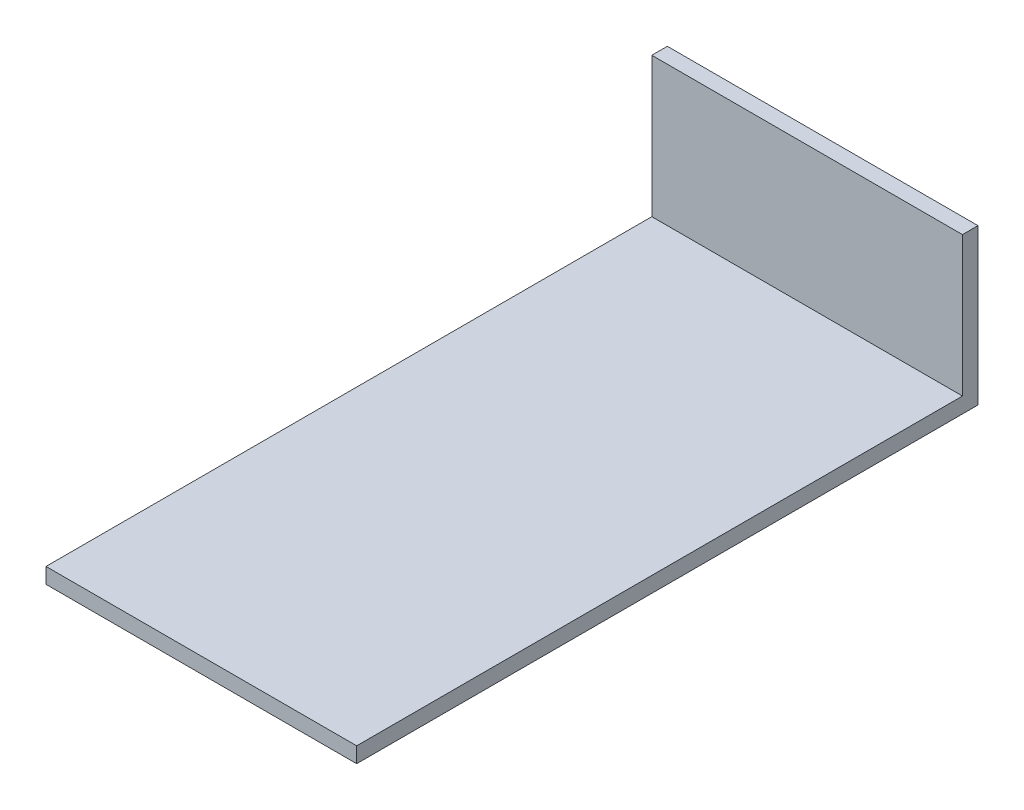
ISO-10303-21;
HEADER;
FILE_DESCRIPTION(('STEP AP214'),'2;1');
FILE_NAME('part.step','',(''),(''),'','','');
FILE_SCHEMA(('AUTOMOTIVE_DESIGN { 1 0 10303 214 1 1 1 1 }'));
ENDSEC;
DATA;
#1=APPLICATION_CONTEXT('core data for automotive mechanical design processes');
#2=APPLICATION_PROTOCOL_DEFINITION('international standard','automotive_design',2000,#1);
#3=PRODUCT_CONTEXT('',#1,'mechanical');
#4=PRODUCT('Part','Part','',(#3));
#5=PRODUCT_RELATED_PRODUCT_CATEGORY('part','',(#4));
#6=PRODUCT_DEFINITION_FORMATION('','',#4);
#7=PRODUCT_DEFINITION_CONTEXT('part definition',#1,'design');
#8=PRODUCT_DEFINITION('design','',#6,#7);
#9=PRODUCT_DEFINITION_SHAPE('','',#8);
#10=(LENGTH_UNIT() NAMED_UNIT(*) SI_UNIT(.MILLI.,.METRE.));
#11=(NAMED_UNIT(*) PLANE_ANGLE_UNIT() SI_UNIT($,.RADIAN.));
#12=(NAMED_UNIT(*) SI_UNIT($,.STERADIAN.) SOLID_ANGLE_UNIT());
#13=UNCERTAINTY_MEASURE_WITH_UNIT(LENGTH_MEASURE(1.E-05),#10,'distance_accuracy_value','');
#14=(GEOMETRIC_REPRESENTATION_CONTEXT(3) GLOBAL_UNCERTAINTY_ASSIGNED_CONTEXT((#13)) GLOBAL_UNIT_ASSIGNED_CONTEXT((#10,
#11,#12)) REPRESENTATION_CONTEXT('',''));
#15=CARTESIAN_POINT('',(0.,0.,0.));
#16=DIRECTION('',(0.,0.,1.));
#17=DIRECTION('',(1.,0.,0.));
#18=AXIS2_PLACEMENT_3D('',#15,#16,#17);
#19=CARTESIAN_POINT('',(12.7,-6.35,50.8));
#20=DIRECTION('',(-1.,0.,0.));
#21=DIRECTION('',(0.,0.,1.));
#22=AXIS2_PLACEMENT_3D('',#19,#20,#21);
#23=PLANE('',#22);
#24=DIRECTION('',(0.,1.,0.));
#25=VECTOR('',#24,1.);
#26=CARTESIAN_POINT('',(12.7,0.,1.27));
#27=LINE('',#26,#25);
#28=CARTESIAN_POINT('',(12.7,-5.08,1.27));
#29=VERTEX_POINT('',#28);
#30=CARTESIAN_POINT('',(12.7,6.35,1.27));
#31=VERTEX_POINT('',#30);
#32=EDGE_CURVE('E123',#29,#31,#27,.T.);
#33=ORIENTED_EDGE('',*,*,#32,.F.);
#34=DIRECTION('',(0.,0.,-1.));
#35=VECTOR('',#34,1.);
#36=CARTESIAN_POINT('',(12.7,-5.08,50.8));
#37=LINE('',#36,#35);
#38=CARTESIAN_POINT('',(12.7,-5.08,50.8));
#39=VERTEX_POINT('',#38);
#40=EDGE_CURVE('E102',#39,#29,#37,.T.);
#41=ORIENTED_EDGE('',*,*,#40,.F.);
#42=DIRECTION('',(0.,1.,0.));
#43=VECTOR('',#42,1.);
#44=CARTESIAN_POINT('',(12.7,-6.35,50.8));
#45=LINE('',#44,#43);
#46=CARTESIAN_POINT('',(12.7,-6.35,50.8));
#47=VERTEX_POINT('',#46);
#48=EDGE_CURVE('E86',#47,#39,#45,.T.);
#49=ORIENTED_EDGE('',*,*,#48,.F.);
#50=DIRECTION('',(0.,0.,-1.));
#51=VECTOR('',#50,1.);
#52=CARTESIAN_POINT('',(12.7,-6.35,50.8));
#53=LINE('',#52,#51);
#54=CARTESIAN_POINT('',(12.7,-6.35,0.));
#55=VERTEX_POINT('',#54);
#56=EDGE_CURVE('E79',#47,#55,#53,.T.);
#57=ORIENTED_EDGE('',*,*,#56,.T.);
#58=DIRECTION('',(0.,1.,0.));
#59=VECTOR('',#58,1.);
#60=CARTESIAN_POINT('',(12.7,-6.35,0.));
#61=LINE('',#60,#59);
#62=CARTESIAN_POINT('',(12.7,6.35,0.));
#63=VERTEX_POINT('',#62);
#64=EDGE_CURVE('E93',#55,#63,#61,.T.);
#65=ORIENTED_EDGE('',*,*,#64,.T.);
#66=DIRECTION('',(0.,0.,-1.));
#67=VECTOR('',#66,1.);
#68=CARTESIAN_POINT('',(12.7,6.35,50.8));
#69=LINE('',#68,#67);
#70=EDGE_CURVE('E11',#31,#63,#69,.T.);
#71=ORIENTED_EDGE('',*,*,#70,.F.);
#72=EDGE_LOOP('',(#33,#41,#49,#57,#65,#71));
#73=FACE_BOUND('',#72,.T.);
#74=ADVANCED_FACE('F35',(#73),#23,.F.);
#75=CARTESIAN_POINT('',(-12.7,6.35,50.8));
#76=DIRECTION('',(0.,-1.,0.));
#77=DIRECTION('',(0.,0.,-1.));
#78=AXIS2_PLACEMENT_3D('',#75,#76,#77);
#79=PLANE('',#78);
#80=DIRECTION('',(-1.,0.,0.));
#81=VECTOR('',#80,1.);
#82=CARTESIAN_POINT('',(0.,6.35,1.27));
#83=LINE('',#82,#81);
#84=CARTESIAN_POINT('',(-12.7,6.35,1.27));
#85=VERTEX_POINT('',#84);
#86=EDGE_CURVE('E120',#31,#85,#83,.T.);
#87=ORIENTED_EDGE('',*,*,#86,.F.);
#88=ORIENTED_EDGE('',*,*,#70,.T.);
#89=DIRECTION('',(-1.,0.,0.));
#90=VECTOR('',#89,1.);
#91=CARTESIAN_POINT('',(-12.7,6.35,0.));
#92=LINE('',#91,#90);
#93=CARTESIAN_POINT('',(-12.7,6.35,0.));
#94=VERTEX_POINT('',#93);
#95=EDGE_CURVE('E99',#63,#94,#92,.T.);
#96=ORIENTED_EDGE('',*,*,#95,.T.);
#97=DIRECTION('',(0.,0.,-1.));
#98=VECTOR('',#97,1.);
#99=CARTESIAN_POINT('',(-12.7,6.35,50.8));
#100=LINE('',#99,#98);
#101=EDGE_CURVE('E42',#85,#94,#100,.T.);
#102=ORIENTED_EDGE('',*,*,#101,.F.);
#103=EDGE_LOOP('',(#87,#88,#96,#102));
#104=FACE_BOUND('',#103,.T.);
#105=ADVANCED_FACE('F117',(#104),#79,.F.);
#106=CARTESIAN_POINT('',(-12.7,-6.35,50.8));
#107=DIRECTION('',(1.,0.,0.));
#108=DIRECTION('',(0.,0.,-1.));
#109=AXIS2_PLACEMENT_3D('',#106,#107,#108);
#110=PLANE('',#109);
#111=DIRECTION('',(0.,-1.,0.));
#112=VECTOR('',#111,1.);
#113=CARTESIAN_POINT('',(-12.7,0.,1.27));
#114=LINE('',#113,#112);
#115=CARTESIAN_POINT('',(-12.7,-5.08,1.27));
#116=VERTEX_POINT('',#115);
#117=EDGE_CURVE('E114',#85,#116,#114,.T.);
#118=ORIENTED_EDGE('',*,*,#117,.F.);
#119=ORIENTED_EDGE('',*,*,#101,.T.);
#120=DIRECTION('',(0.,-1.,0.));
#121=VECTOR('',#120,1.);
#122=CARTESIAN_POINT('',(-12.7,-6.35,0.));
#123=LINE('',#122,#121);
#124=CARTESIAN_POINT('',(-12.7,-6.35,0.));
#125=VERTEX_POINT('',#124);
#126=EDGE_CURVE('E87',#94,#125,#123,.T.);
#127=ORIENTED_EDGE('',*,*,#126,.T.);
#128=DIRECTION('',(0.,0.,-1.));
#129=VECTOR('',#128,1.);
#130=CARTESIAN_POINT('',(-12.7,-6.35,50.8));
#131=LINE('',#130,#129);
#132=CARTESIAN_POINT('',(-12.7,-6.35,50.8));
#133=VERTEX_POINT('',#132);
#134=EDGE_CURVE('E82',#133,#125,#131,.T.);
#135=ORIENTED_EDGE('',*,*,#134,.F.);
#136=DIRECTION('',(0.,-1.,0.));
#137=VECTOR('',#136,1.);
#138=CARTESIAN_POINT('',(-12.7,-6.35,50.8));
#139=LINE('',#138,#137);
#140=CARTESIAN_POINT('',(-12.7,-5.08,50.8));
#141=VERTEX_POINT('',#140);
#142=EDGE_CURVE('E143',#141,#133,#139,.T.);
#143=ORIENTED_EDGE('',*,*,#142,.F.);
#144=DIRECTION('',(0.,0.,-1.));
#145=VECTOR('',#144,1.);
#146=CARTESIAN_POINT('',(-12.7,-5.08,50.8));
#147=LINE('',#146,#145);
#148=EDGE_CURVE('E49',#141,#116,#147,.T.);
#149=ORIENTED_EDGE('',*,*,#148,.T.);
#150=EDGE_LOOP('',(#118,#119,#127,#135,#143,#149));
#151=FACE_BOUND('',#150,.T.);
#152=ADVANCED_FACE('F111',(#151),#110,.F.);
#153=CARTESIAN_POINT('',(0.,0.,50.8));
#154=DIRECTION('',(0.,0.,-1.));
#155=DIRECTION('',(-1.,0.,0.));
#156=AXIS2_PLACEMENT_3D('',#153,#154,#155);
#157=PLANE('',#156);
#158=DIRECTION('',(1.,0.,0.));
#159=VECTOR('',#158,1.);
#160=CARTESIAN_POINT('',(0.,-5.08,50.8));
#161=LINE('',#160,#159);
#162=EDGE_CURVE('E132',#141,#39,#161,.T.);
#163=ORIENTED_EDGE('',*,*,#162,.F.);
#164=ORIENTED_EDGE('',*,*,#142,.T.);
#165=DIRECTION('',(1.,0.,0.));
#166=VECTOR('',#165,1.);
#167=CARTESIAN_POINT('',(-12.7,-6.35,50.8));
#168=LINE('',#167,#166);
#169=EDGE_CURVE('E58',#133,#47,#168,.T.);
#170=ORIENTED_EDGE('',*,*,#169,.T.);
#171=ORIENTED_EDGE('',*,*,#48,.T.);
#172=EDGE_LOOP('',(#163,#164,#170,#171));
#173=FACE_BOUND('',#172,.T.);
#174=ADVANCED_FACE('F145',(#173),#157,.F.);
#175=CARTESIAN_POINT('',(-12.7,-6.35,50.8));
#176=DIRECTION('',(0.,1.,0.));
#177=DIRECTION('',(0.,0.,1.));
#178=AXIS2_PLACEMENT_3D('',#175,#176,#177);
#179=PLANE('',#178);
#180=DIRECTION('',(1.,0.,0.));
#181=VECTOR('',#180,1.);
#182=CARTESIAN_POINT('',(-12.7,-6.35,0.));
#183=LINE('',#182,#181);
#184=EDGE_CURVE('E76',#125,#55,#183,.T.);
#185=ORIENTED_EDGE('',*,*,#184,.T.);
#186=ORIENTED_EDGE('',*,*,#56,.F.);
#187=ORIENTED_EDGE('',*,*,#169,.F.);
#188=ORIENTED_EDGE('',*,*,#134,.T.);
#189=EDGE_LOOP('',(#185,#186,#187,#188));
#190=FACE_BOUND('',#189,.T.);
#191=ADVANCED_FACE('F78',(#190),#179,.F.);
#192=CARTESIAN_POINT('',(0.,0.,0.));
#193=DIRECTION('',(0.,0.,-1.));
#194=DIRECTION('',(-1.,0.,0.));
#195=AXIS2_PLACEMENT_3D('',#192,#193,#194);
#196=PLANE('',#195);
#197=ORIENTED_EDGE('',*,*,#64,.F.);
#198=ORIENTED_EDGE('',*,*,#184,.F.);
#199=ORIENTED_EDGE('',*,*,#126,.F.);
#200=ORIENTED_EDGE('',*,*,#95,.F.);
#201=EDGE_LOOP('',(#197,#198,#199,#200));
#202=FACE_BOUND('',#201,.T.);
#203=ADVANCED_FACE('F97',(#202),#196,.T.);
#204=CARTESIAN_POINT('',(-12.7,-5.08,50.8));
#205=DIRECTION('',(0.,1.,0.));
#206=DIRECTION('',(0.,0.,1.));
#207=AXIS2_PLACEMENT_3D('',#204,#205,#206);
#208=PLANE('',#207);
#209=DIRECTION('',(1.,0.,0.));
#210=VECTOR('',#209,1.);
#211=CARTESIAN_POINT('',(0.,-5.08,1.27));
#212=LINE('',#211,#210);
#213=EDGE_CURVE('E133',#116,#29,#212,.T.);
#214=ORIENTED_EDGE('',*,*,#213,.F.);
#215=ORIENTED_EDGE('',*,*,#148,.F.);
#216=ORIENTED_EDGE('',*,*,#162,.T.);
#217=ORIENTED_EDGE('',*,*,#40,.T.);
#218=EDGE_LOOP('',(#214,#215,#216,#217));
#219=FACE_BOUND('',#218,.T.);
#220=ADVANCED_FACE('F136',(#219),#208,.T.);
#221=CARTESIAN_POINT('',(0.,0.,1.27));
#222=DIRECTION('',(0.,0.,-1.));
#223=DIRECTION('',(-1.,0.,0.));
#224=AXIS2_PLACEMENT_3D('',#221,#222,#223);
#225=PLANE('',#224);
#226=ORIENTED_EDGE('',*,*,#32,.T.);
#227=ORIENTED_EDGE('',*,*,#86,.T.);
#228=ORIENTED_EDGE('',*,*,#117,.T.);
#229=ORIENTED_EDGE('',*,*,#213,.T.);
#230=EDGE_LOOP('',(#226,#227,#228,#229));
#231=FACE_BOUND('',#230,.T.);
#232=ADVANCED_FACE('F134',(#231),#225,.F.);
#233=CLOSED_SHELL('',(#74,#105,#152,#174,#191,#203,#220,#232));
#234=MANIFOLD_SOLID_BREP('B2',#233);
#235=ADVANCED_BREP_SHAPE_REPRESENTATION('',(#18,#234),#14);
#236=SHAPE_DEFINITION_REPRESENTATION(#9,#235);
ENDSEC;
END-ISO-10303-21;
